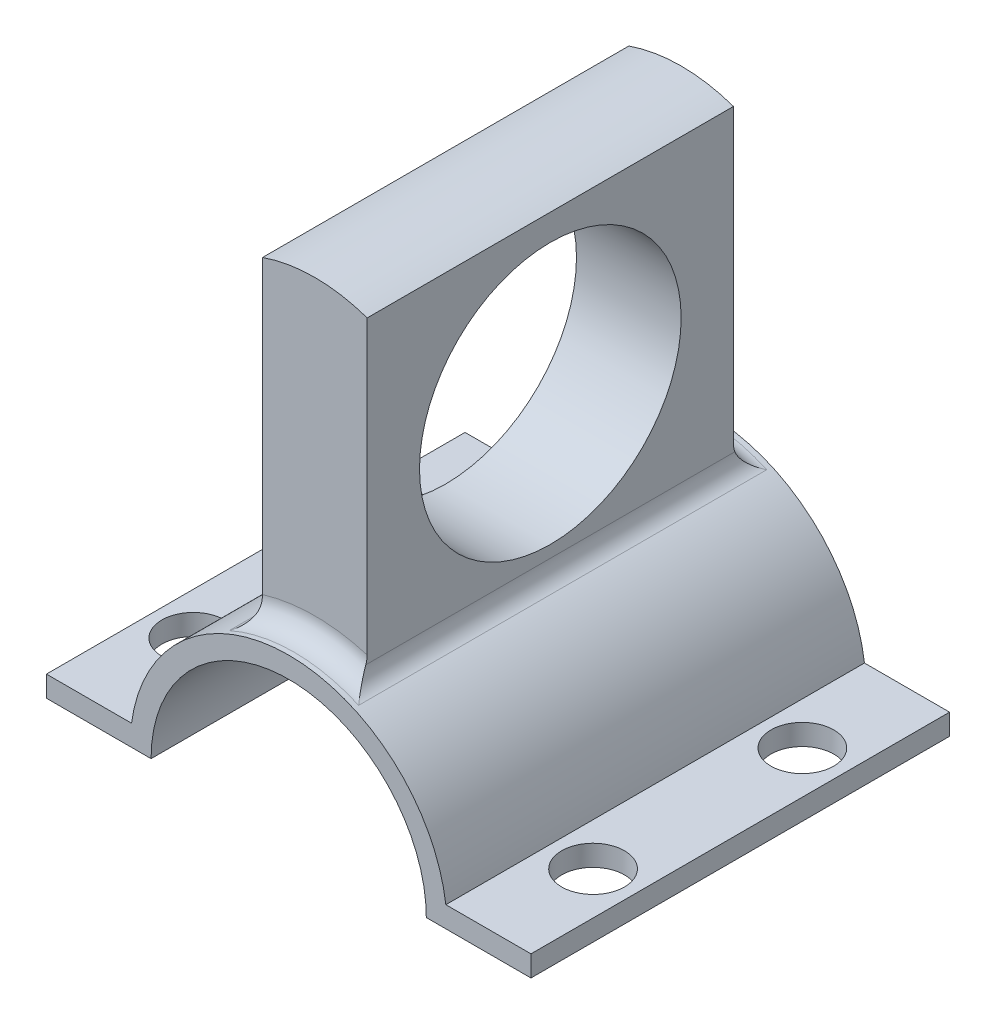
ISO-10303-21;
HEADER;
FILE_DESCRIPTION(('STEP AP214'),'2;1');
FILE_NAME('part.step','',(''),(''),'','','');
FILE_SCHEMA(('AUTOMOTIVE_DESIGN { 1 0 10303 214 1 1 1 1 }'));
ENDSEC;
DATA;
#1=APPLICATION_CONTEXT('core data for automotive mechanical design processes');
#2=APPLICATION_PROTOCOL_DEFINITION('international standard','automotive_design',2000,#1);
#3=PRODUCT_CONTEXT('',#1,'mechanical');
#4=PRODUCT('Part','Part','',(#3));
#5=PRODUCT_RELATED_PRODUCT_CATEGORY('part','',(#4));
#6=PRODUCT_DEFINITION_FORMATION('','',#4);
#7=PRODUCT_DEFINITION_CONTEXT('part definition',#1,'design');
#8=PRODUCT_DEFINITION('design','',#6,#7);
#9=PRODUCT_DEFINITION_SHAPE('','',#8);
#10=(LENGTH_UNIT() NAMED_UNIT(*) SI_UNIT(.MILLI.,.METRE.));
#11=(NAMED_UNIT(*) PLANE_ANGLE_UNIT() SI_UNIT($,.RADIAN.));
#12=(NAMED_UNIT(*) SI_UNIT($,.STERADIAN.) SOLID_ANGLE_UNIT());
#13=UNCERTAINTY_MEASURE_WITH_UNIT(LENGTH_MEASURE(1.E-05),#10,'distance_accuracy_value','');
#14=(GEOMETRIC_REPRESENTATION_CONTEXT(3) GLOBAL_UNCERTAINTY_ASSIGNED_CONTEXT((#13)) GLOBAL_UNIT_ASSIGNED_CONTEXT((#10,
#11,#12)) REPRESENTATION_CONTEXT('',''));
#15=CARTESIAN_POINT('',(0.,0.,0.));
#16=DIRECTION('',(0.,0.,1.));
#17=DIRECTION('',(1.,0.,0.));
#18=AXIS2_PLACEMENT_3D('',#15,#16,#17);
#19=CARTESIAN_POINT('',(16.7005,0.,25.4));
#20=DIRECTION('',(0.,1.,0.));
#21=DIRECTION('',(-1.,0.,0.));
#22=AXIS2_PLACEMENT_3D('',#19,#20,#21);
#23=PLANE('',#22);
#24=CARTESIAN_POINT('',(24.2363031700751,0.,-12.7));
#25=DIRECTION('',(0.,1.,0.));
#26=DIRECTION('',(-1.,0.,0.));
#27=AXIS2_PLACEMENT_3D('',#24,#25,#26);
#28=CIRCLE('',#27,3.81);
#29=CARTESIAN_POINT('',(20.4263031700751,0.,-12.7));
#30=VERTEX_POINT('',#29);
#31=EDGE_CURVE('E197',#30,#30,#28,.T.);
#32=ORIENTED_EDGE('',*,*,#31,.T.);
#33=EDGE_LOOP('',(#32));
#34=FACE_BOUND('',#33,.T.);
#35=CARTESIAN_POINT('',(24.2363031700751,0.,12.7));
#36=DIRECTION('',(0.,1.,0.));
#37=DIRECTION('',(-1.,0.,0.));
#38=AXIS2_PLACEMENT_3D('',#35,#36,#37);
#39=CIRCLE('',#38,3.81);
#40=CARTESIAN_POINT('',(20.4263031700751,0.,12.7));
#41=VERTEX_POINT('',#40);
#42=EDGE_CURVE('E204',#41,#41,#39,.T.);
#43=ORIENTED_EDGE('',*,*,#42,.T.);
#44=EDGE_LOOP('',(#43));
#45=FACE_BOUND('',#44,.T.);
#46=DIRECTION('',(1.,0.,0.));
#47=VECTOR('',#46,1.);
#48=CARTESIAN_POINT('',(16.7005,0.,-25.4));
#49=LINE('',#48,#47);
#50=CARTESIAN_POINT('',(16.7005,0.,-25.4));
#51=VERTEX_POINT('',#50);
#52=CARTESIAN_POINT('',(29.4005,0.,-25.4));
#53=VERTEX_POINT('',#52);
#54=EDGE_CURVE('E207',#51,#53,#49,.T.);
#55=ORIENTED_EDGE('',*,*,#54,.T.);
#56=DIRECTION('',(0.,0.,-1.));
#57=VECTOR('',#56,1.);
#58=CARTESIAN_POINT('',(29.4005,0.,25.4));
#59=LINE('',#58,#57);
#60=CARTESIAN_POINT('',(29.4005,0.,25.4));
#61=VERTEX_POINT('',#60);
#62=EDGE_CURVE('E266',#61,#53,#59,.T.);
#63=ORIENTED_EDGE('',*,*,#62,.F.);
#64=DIRECTION('',(1.,0.,0.));
#65=VECTOR('',#64,1.);
#66=CARTESIAN_POINT('',(16.7005,0.,25.4));
#67=LINE('',#66,#65);
#68=CARTESIAN_POINT('',(16.7005,0.,25.4));
#69=VERTEX_POINT('',#68);
#70=EDGE_CURVE('E208',#69,#61,#67,.T.);
#71=ORIENTED_EDGE('',*,*,#70,.F.);
#72=DIRECTION('',(0.,0.,-1.));
#73=VECTOR('',#72,1.);
#74=CARTESIAN_POINT('',(16.7005,0.,25.4));
#75=LINE('',#74,#73);
#76=EDGE_CURVE('E230',#69,#51,#75,.T.);
#77=ORIENTED_EDGE('',*,*,#76,.T.);
#78=EDGE_LOOP('',(#55,#63,#71,#77));
#79=FACE_BOUND('',#78,.T.);
#80=ADVANCED_FACE('F33',(#34,#45,#79),#23,.F.);
#81=CARTESIAN_POINT('',(29.4005,2.54,25.4));
#82=DIRECTION('',(1.,0.,0.));
#83=DIRECTION('',(0.,0.,-1.));
#84=AXIS2_PLACEMENT_3D('',#81,#82,#83);
#85=PLANE('',#84);
#86=DIRECTION('',(0.,-1.,0.));
#87=VECTOR('',#86,1.);
#88=CARTESIAN_POINT('',(29.4005,2.54,-25.4));
#89=LINE('',#88,#87);
#90=CARTESIAN_POINT('',(29.4005,2.54,-25.4));
#91=VERTEX_POINT('',#90);
#92=EDGE_CURVE('E233',#91,#53,#89,.T.);
#93=ORIENTED_EDGE('',*,*,#92,.F.);
#94=DIRECTION('',(0.,0.,-1.));
#95=VECTOR('',#94,1.);
#96=CARTESIAN_POINT('',(29.4005,2.54,25.4));
#97=LINE('',#96,#95);
#98=CARTESIAN_POINT('',(29.4005,2.54,25.4));
#99=VERTEX_POINT('',#98);
#100=EDGE_CURVE('E264',#99,#91,#97,.T.);
#101=ORIENTED_EDGE('',*,*,#100,.F.);
#102=DIRECTION('',(0.,-1.,0.));
#103=VECTOR('',#102,1.);
#104=CARTESIAN_POINT('',(29.4005,2.54,25.4));
#105=LINE('',#104,#103);
#106=EDGE_CURVE('E210',#99,#61,#105,.T.);
#107=ORIENTED_EDGE('',*,*,#106,.T.);
#108=ORIENTED_EDGE('',*,*,#62,.T.);
#109=EDGE_LOOP('',(#93,#101,#107,#108));
#110=FACE_BOUND('',#109,.T.);
#111=ADVANCED_FACE('F366',(#110),#85,.T.);
#112=CARTESIAN_POINT('',(16.7005,2.54,25.4));
#113=DIRECTION('',(0.,1.,0.));
#114=DIRECTION('',(-1.,0.,0.));
#115=AXIS2_PLACEMENT_3D('',#112,#113,#114);
#116=PLANE('',#115);
#117=CARTESIAN_POINT('',(24.2363031700751,2.54,-12.7));
#118=DIRECTION('',(0.,1.,0.));
#119=DIRECTION('',(0.,0.,1.));
#120=AXIS2_PLACEMENT_3D('',#117,#118,#119);
#121=CIRCLE('',#120,3.81);
#122=CARTESIAN_POINT('',(24.2363031700751,2.54,-8.89));
#123=VERTEX_POINT('',#122);
#124=EDGE_CURVE('E188',#123,#123,#121,.T.);
#125=ORIENTED_EDGE('',*,*,#124,.F.);
#126=EDGE_LOOP('',(#125));
#127=FACE_BOUND('',#126,.T.);
#128=CARTESIAN_POINT('',(24.2363031700751,2.54,12.7));
#129=DIRECTION('',(0.,1.,0.));
#130=DIRECTION('',(0.,0.,1.));
#131=AXIS2_PLACEMENT_3D('',#128,#129,#130);
#132=CIRCLE('',#131,3.81);
#133=CARTESIAN_POINT('',(24.2363031700751,2.54,16.51));
#134=VERTEX_POINT('',#133);
#135=EDGE_CURVE('E200',#134,#134,#132,.T.);
#136=ORIENTED_EDGE('',*,*,#135,.F.);
#137=EDGE_LOOP('',(#136));
#138=FACE_BOUND('',#137,.T.);
#139=DIRECTION('',(1.,0.,0.));
#140=VECTOR('',#139,1.);
#141=CARTESIAN_POINT('',(16.7005,2.54,-25.4));
#142=LINE('',#141,#140);
#143=CARTESIAN_POINT('',(19.0721063401503,2.54,-25.4));
#144=VERTEX_POINT('',#143);
#145=EDGE_CURVE('E236',#144,#91,#142,.T.);
#146=ORIENTED_EDGE('',*,*,#145,.F.);
#147=DIRECTION('',(0.,0.,-1.));
#148=VECTOR('',#147,1.);
#149=CARTESIAN_POINT('',(19.0721063401503,2.54,25.4));
#150=LINE('',#149,#148);
#151=CARTESIAN_POINT('',(19.0721063401503,2.54,25.4));
#152=VERTEX_POINT('',#151);
#153=EDGE_CURVE('E262',#152,#144,#150,.T.);
#154=ORIENTED_EDGE('',*,*,#153,.F.);
#155=DIRECTION('',(1.,0.,0.));
#156=VECTOR('',#155,1.);
#157=CARTESIAN_POINT('',(16.7005,2.54,25.4));
#158=LINE('',#157,#156);
#159=EDGE_CURVE('E214',#152,#99,#158,.T.);
#160=ORIENTED_EDGE('',*,*,#159,.T.);
#161=ORIENTED_EDGE('',*,*,#100,.T.);
#162=EDGE_LOOP('',(#146,#154,#160,#161));
#163=FACE_BOUND('',#162,.T.);
#164=ADVANCED_FACE('F371',(#127,#138,#163),#116,.T.);
#165=CARTESIAN_POINT('',(0.,0.,25.4));
#166=DIRECTION('',(0.,0.,-1.));
#167=DIRECTION('',(-1.,0.,0.));
#168=AXIS2_PLACEMENT_3D('',#165,#166,#167);
#169=CYLINDRICAL_SURFACE('',#168,19.2405);
#170=DIRECTION('',(0.,0.,-1.));
#171=VECTOR('',#170,1.);
#172=CARTESIAN_POINT('',(-7.85326530612244,17.5648246299715,25.4));
#173=LINE('',#172,#171);
#174=CARTESIAN_POINT('',(-7.85326530612245,17.5648246299715,24.765));
#175=VERTEX_POINT('',#174);
#176=CARTESIAN_POINT('',(-7.85326530612245,17.5648246299715,-24.765));
#177=VERTEX_POINT('',#176);
#178=EDGE_CURVE('E279',#175,#177,#173,.T.);
#179=ORIENTED_EDGE('',*,*,#178,.T.);
#180=CARTESIAN_POINT('',(0.,0.,-24.765));
#181=DIRECTION('',(0.,0.,-1.));
#182=DIRECTION('',(-1.,0.,0.));
#183=AXIS2_PLACEMENT_3D('',#180,#181,#182);
#184=CIRCLE('',#183,19.2405);
#185=CARTESIAN_POINT('',(7.85326530612245,17.5648246299715,-24.765));
#186=VERTEX_POINT('',#185);
#187=EDGE_CURVE('E281',#177,#186,#184,.T.);
#188=ORIENTED_EDGE('',*,*,#187,.T.);
#189=DIRECTION('',(0.,0.,-1.));
#190=VECTOR('',#189,1.);
#191=CARTESIAN_POINT('',(7.85326530612245,17.5648246299715,25.4));
#192=LINE('',#191,#190);
#193=CARTESIAN_POINT('',(7.85326530612245,17.5648246299715,24.765));
#194=VERTEX_POINT('',#193);
#195=EDGE_CURVE('E275',#186,#194,#192,.F.);
#196=ORIENTED_EDGE('',*,*,#195,.T.);
#197=CARTESIAN_POINT('',(0.,0.,24.765));
#198=DIRECTION('',(0.,0.,1.));
#199=DIRECTION('',(1.,0.,0.));
#200=AXIS2_PLACEMENT_3D('',#197,#198,#199);
#201=CIRCLE('',#200,19.2405);
#202=EDGE_CURVE('E277',#194,#175,#201,.T.);
#203=ORIENTED_EDGE('',*,*,#202,.T.);
#204=EDGE_LOOP('',(#179,#188,#196,#203));
#205=FACE_BOUND('',#204,.T.);
#206=CARTESIAN_POINT('',(0.,0.,-25.4));
#207=DIRECTION('',(0.,0.,1.));
#208=DIRECTION('',(1.,0.,0.));
#209=AXIS2_PLACEMENT_3D('',#206,#207,#208);
#210=CIRCLE('',#209,19.2405);
#211=CARTESIAN_POINT('',(-19.0721063401503,2.54,-25.4));
#212=VERTEX_POINT('',#211);
#213=EDGE_CURVE('E239',#212,#144,#210,.F.);
#214=ORIENTED_EDGE('',*,*,#213,.F.);
#215=DIRECTION('',(0.,0.,-1.));
#216=VECTOR('',#215,1.);
#217=CARTESIAN_POINT('',(-19.0721063401503,2.54,25.4));
#218=LINE('',#217,#216);
#219=CARTESIAN_POINT('',(-19.0721063401503,2.54,25.4));
#220=VERTEX_POINT('',#219);
#221=EDGE_CURVE('E260',#220,#212,#218,.T.);
#222=ORIENTED_EDGE('',*,*,#221,.F.);
#223=CARTESIAN_POINT('',(0.,0.,25.4));
#224=DIRECTION('',(0.,0.,1.));
#225=DIRECTION('',(1.,0.,0.));
#226=AXIS2_PLACEMENT_3D('',#223,#224,#225);
#227=CIRCLE('',#226,19.2405);
#228=EDGE_CURVE('E217',#220,#152,#227,.F.);
#229=ORIENTED_EDGE('',*,*,#228,.T.);
#230=ORIENTED_EDGE('',*,*,#153,.T.);
#231=EDGE_LOOP('',(#214,#222,#229,#230));
#232=FACE_BOUND('',#231,.T.);
#233=ADVANCED_FACE('F352',(#205,#232),#169,.T.);
#234=CARTESIAN_POINT('',(-16.7005,2.54,25.4));
#235=DIRECTION('',(0.,1.,0.));
#236=DIRECTION('',(-1.,0.,0.));
#237=AXIS2_PLACEMENT_3D('',#234,#235,#236);
#238=PLANE('',#237);
#239=CARTESIAN_POINT('',(-24.2776968299249,2.54,12.7000000000003));
#240=DIRECTION('',(0.,1.,0.));
#241=DIRECTION('',(0.,0.,1.));
#242=AXIS2_PLACEMENT_3D('',#239,#240,#241);
#243=CIRCLE('',#242,3.81);
#244=CARTESIAN_POINT('',(-24.2776968299249,2.54,16.5100000000003));
#245=VERTEX_POINT('',#244);
#246=EDGE_CURVE('E192',#245,#245,#243,.T.);
#247=ORIENTED_EDGE('',*,*,#246,.F.);
#248=EDGE_LOOP('',(#247));
#249=FACE_BOUND('',#248,.T.);
#250=CARTESIAN_POINT('',(-24.2776968299249,2.54,-12.6999999999997));
#251=DIRECTION('',(0.,1.,0.));
#252=DIRECTION('',(0.,0.,1.));
#253=AXIS2_PLACEMENT_3D('',#250,#251,#252);
#254=CIRCLE('',#253,3.81);
#255=CARTESIAN_POINT('',(-24.2776968299249,2.54,-8.88999999999966));
#256=VERTEX_POINT('',#255);
#257=EDGE_CURVE('E170',#256,#256,#254,.T.);
#258=ORIENTED_EDGE('',*,*,#257,.F.);
#259=EDGE_LOOP('',(#258));
#260=FACE_BOUND('',#259,.T.);
#261=DIRECTION('',(1.,0.,0.));
#262=VECTOR('',#261,1.);
#263=CARTESIAN_POINT('',(-16.7005,2.54,-25.4));
#264=LINE('',#263,#262);
#265=CARTESIAN_POINT('',(-29.4005,2.54,-25.4));
#266=VERTEX_POINT('',#265);
#267=EDGE_CURVE('E242',#266,#212,#264,.T.);
#268=ORIENTED_EDGE('',*,*,#267,.F.);
#269=DIRECTION('',(0.,0.,-1.));
#270=VECTOR('',#269,1.);
#271=CARTESIAN_POINT('',(-29.4005,2.54,25.4));
#272=LINE('',#271,#270);
#273=CARTESIAN_POINT('',(-29.4005,2.54,25.4));
#274=VERTEX_POINT('',#273);
#275=EDGE_CURVE('E258',#274,#266,#272,.T.);
#276=ORIENTED_EDGE('',*,*,#275,.F.);
#277=DIRECTION('',(1.,0.,0.));
#278=VECTOR('',#277,1.);
#279=CARTESIAN_POINT('',(-16.7005,2.54,25.4));
#280=LINE('',#279,#278);
#281=EDGE_CURVE('E220',#274,#220,#280,.T.);
#282=ORIENTED_EDGE('',*,*,#281,.T.);
#283=ORIENTED_EDGE('',*,*,#221,.T.);
#284=EDGE_LOOP('',(#268,#276,#282,#283));
#285=FACE_BOUND('',#284,.T.);
#286=ADVANCED_FACE('F381',(#249,#260,#285),#238,.T.);
#287=CARTESIAN_POINT('',(-29.4005,0.,25.4));
#288=DIRECTION('',(-1.,0.,0.));
#289=DIRECTION('',(0.,0.,1.));
#290=AXIS2_PLACEMENT_3D('',#287,#288,#289);
#291=PLANE('',#290);
#292=DIRECTION('',(0.,1.,0.));
#293=VECTOR('',#292,1.);
#294=CARTESIAN_POINT('',(-29.4005,0.,-25.4));
#295=LINE('',#294,#293);
#296=CARTESIAN_POINT('',(-29.4005,0.,-25.4));
#297=VERTEX_POINT('',#296);
#298=EDGE_CURVE('E245',#297,#266,#295,.T.);
#299=ORIENTED_EDGE('',*,*,#298,.F.);
#300=DIRECTION('',(0.,0.,-1.));
#301=VECTOR('',#300,1.);
#302=CARTESIAN_POINT('',(-29.4005,0.,25.4));
#303=LINE('',#302,#301);
#304=CARTESIAN_POINT('',(-29.4005,0.,25.4));
#305=VERTEX_POINT('',#304);
#306=EDGE_CURVE('E256',#305,#297,#303,.T.);
#307=ORIENTED_EDGE('',*,*,#306,.F.);
#308=DIRECTION('',(0.,1.,0.));
#309=VECTOR('',#308,1.);
#310=CARTESIAN_POINT('',(-29.4005,0.,25.4));
#311=LINE('',#310,#309);
#312=EDGE_CURVE('E223',#305,#274,#311,.T.);
#313=ORIENTED_EDGE('',*,*,#312,.T.);
#314=ORIENTED_EDGE('',*,*,#275,.T.);
#315=EDGE_LOOP('',(#299,#307,#313,#314));
#316=FACE_BOUND('',#315,.T.);
#317=ADVANCED_FACE('F384',(#316),#291,.T.);
#318=CARTESIAN_POINT('',(-16.7005,0.,25.4));
#319=DIRECTION('',(0.,1.,0.));
#320=DIRECTION('',(-1.,0.,0.));
#321=AXIS2_PLACEMENT_3D('',#318,#319,#320);
#322=PLANE('',#321);
#323=CARTESIAN_POINT('',(-24.2776968299249,0.,12.7000000000003));
#324=DIRECTION('',(0.,1.,0.));
#325=DIRECTION('',(-1.,0.,0.));
#326=AXIS2_PLACEMENT_3D('',#323,#324,#325);
#327=CIRCLE('',#326,3.81);
#328=CARTESIAN_POINT('',(-28.0876968299249,0.,12.7000000000003));
#329=VERTEX_POINT('',#328);
#330=EDGE_CURVE('E201',#329,#329,#327,.T.);
#331=ORIENTED_EDGE('',*,*,#330,.T.);
#332=EDGE_LOOP('',(#331));
#333=FACE_BOUND('',#332,.T.);
#334=CARTESIAN_POINT('',(-24.2776968299249,0.,-12.6999999999997));
#335=DIRECTION('',(0.,1.,0.));
#336=DIRECTION('',(-1.,0.,0.));
#337=AXIS2_PLACEMENT_3D('',#334,#335,#336);
#338=CIRCLE('',#337,3.81);
#339=CARTESIAN_POINT('',(-28.0876968299249,0.,-12.6999999999997));
#340=VERTEX_POINT('',#339);
#341=EDGE_CURVE('E191',#340,#340,#338,.T.);
#342=ORIENTED_EDGE('',*,*,#341,.T.);
#343=EDGE_LOOP('',(#342));
#344=FACE_BOUND('',#343,.T.);
#345=DIRECTION('',(1.,0.,0.));
#346=VECTOR('',#345,1.);
#347=CARTESIAN_POINT('',(-16.7005,0.,-25.4));
#348=LINE('',#347,#346);
#349=CARTESIAN_POINT('',(-16.7005,0.,-25.4));
#350=VERTEX_POINT('',#349);
#351=EDGE_CURVE('E248',#297,#350,#348,.T.);
#352=ORIENTED_EDGE('',*,*,#351,.T.);
#353=DIRECTION('',(0.,0.,-1.));
#354=VECTOR('',#353,1.);
#355=CARTESIAN_POINT('',(-16.7005,0.,25.4));
#356=LINE('',#355,#354);
#357=CARTESIAN_POINT('',(-16.7005,0.,25.4));
#358=VERTEX_POINT('',#357);
#359=EDGE_CURVE('E253',#358,#350,#356,.T.);
#360=ORIENTED_EDGE('',*,*,#359,.F.);
#361=DIRECTION('',(1.,0.,0.));
#362=VECTOR('',#361,1.);
#363=CARTESIAN_POINT('',(-16.7005,0.,25.4));
#364=LINE('',#363,#362);
#365=EDGE_CURVE('E226',#305,#358,#364,.T.);
#366=ORIENTED_EDGE('',*,*,#365,.F.);
#367=ORIENTED_EDGE('',*,*,#306,.T.);
#368=EDGE_LOOP('',(#352,#360,#366,#367));
#369=FACE_BOUND('',#368,.T.);
#370=ADVANCED_FACE('F388',(#333,#344,#369),#322,.F.);
#371=CARTESIAN_POINT('',(0.,0.,25.4));
#372=DIRECTION('',(0.,0.,-1.));
#373=DIRECTION('',(-1.,0.,0.));
#374=AXIS2_PLACEMENT_3D('',#371,#372,#373);
#375=CYLINDRICAL_SURFACE('',#374,16.7005);
#376=CARTESIAN_POINT('',(0.,0.,-25.4));
#377=DIRECTION('',(0.,0.,-1.));
#378=DIRECTION('',(-1.,0.,0.));
#379=AXIS2_PLACEMENT_3D('',#376,#377,#378);
#380=CIRCLE('',#379,16.7005);
#381=EDGE_CURVE('E211',#350,#51,#380,.T.);
#382=ORIENTED_EDGE('',*,*,#381,.T.);
#383=ORIENTED_EDGE('',*,*,#76,.F.);
#384=CARTESIAN_POINT('',(0.,0.,25.4));
#385=DIRECTION('',(0.,0.,-1.));
#386=DIRECTION('',(-1.,0.,0.));
#387=AXIS2_PLACEMENT_3D('',#384,#385,#386);
#388=CIRCLE('',#387,16.7005);
#389=EDGE_CURVE('E228',#358,#69,#388,.T.);
#390=ORIENTED_EDGE('',*,*,#389,.F.);
#391=ORIENTED_EDGE('',*,*,#359,.T.);
#392=EDGE_LOOP('',(#382,#383,#390,#391));
#393=FACE_BOUND('',#392,.T.);
#394=ADVANCED_FACE('F392',(#393),#375,.F.);
#395=CARTESIAN_POINT('',(0.,0.,25.4));
#396=DIRECTION('',(0.,0.,1.));
#397=DIRECTION('',(1.,0.,0.));
#398=AXIS2_PLACEMENT_3D('',#395,#396,#397);
#399=PLANE('',#398);
#400=ORIENTED_EDGE('',*,*,#70,.T.);
#401=ORIENTED_EDGE('',*,*,#106,.F.);
#402=ORIENTED_EDGE('',*,*,#159,.F.);
#403=ORIENTED_EDGE('',*,*,#228,.F.);
#404=ORIENTED_EDGE('',*,*,#281,.F.);
#405=ORIENTED_EDGE('',*,*,#312,.F.);
#406=ORIENTED_EDGE('',*,*,#365,.T.);
#407=ORIENTED_EDGE('',*,*,#389,.T.);
#408=EDGE_LOOP('',(#400,#401,#402,#403,#404,#405,#406,#407));
#409=FACE_BOUND('',#408,.T.);
#410=ADVANCED_FACE('F396',(#409),#399,.T.);
#411=CARTESIAN_POINT('',(0.,0.,-25.4));
#412=DIRECTION('',(0.,0.,1.));
#413=DIRECTION('',(1.,0.,0.));
#414=AXIS2_PLACEMENT_3D('',#411,#412,#413);
#415=PLANE('',#414);
#416=ORIENTED_EDGE('',*,*,#54,.F.);
#417=ORIENTED_EDGE('',*,*,#381,.F.);
#418=ORIENTED_EDGE('',*,*,#351,.F.);
#419=ORIENTED_EDGE('',*,*,#298,.T.);
#420=ORIENTED_EDGE('',*,*,#267,.T.);
#421=ORIENTED_EDGE('',*,*,#213,.T.);
#422=ORIENTED_EDGE('',*,*,#145,.T.);
#423=ORIENTED_EDGE('',*,*,#92,.T.);
#424=EDGE_LOOP('',(#416,#417,#418,#419,#420,#421,#422,#423));
#425=FACE_BOUND('',#424,.T.);
#426=ADVANCED_FACE('F398',(#425),#415,.F.);
#427=CARTESIAN_POINT('',(24.2363031700751,-8.382,12.7));
#428=DIRECTION('',(0.,1.,0.));
#429=DIRECTION('',(0.,0.,1.));
#430=AXIS2_PLACEMENT_3D('',#427,#428,#429);
#431=CYLINDRICAL_SURFACE('',#430,3.81);
#432=ORIENTED_EDGE('',*,*,#135,.T.);
#433=EDGE_LOOP('',(#432));
#434=FACE_BOUND('',#433,.T.);
#435=ORIENTED_EDGE('',*,*,#42,.F.);
#436=EDGE_LOOP('',(#435));
#437=FACE_BOUND('',#436,.T.);
#438=ADVANCED_FACE('F401',(#434,#437),#431,.F.);
#439=CARTESIAN_POINT('',(-24.2776968299249,-8.382,-12.6999999999997));
#440=DIRECTION('',(0.,1.,0.));
#441=DIRECTION('',(0.,0.,1.));
#442=AXIS2_PLACEMENT_3D('',#439,#440,#441);
#443=CYLINDRICAL_SURFACE('',#442,3.81);
#444=ORIENTED_EDGE('',*,*,#257,.T.);
#445=EDGE_LOOP('',(#444));
#446=FACE_BOUND('',#445,.T.);
#447=ORIENTED_EDGE('',*,*,#341,.F.);
#448=EDGE_LOOP('',(#447));
#449=FACE_BOUND('',#448,.T.);
#450=ADVANCED_FACE('F408',(#446,#449),#443,.F.);
#451=CARTESIAN_POINT('',(-24.2776968299249,-8.382,12.7000000000003));
#452=DIRECTION('',(0.,1.,0.));
#453=DIRECTION('',(0.,0.,1.));
#454=AXIS2_PLACEMENT_3D('',#451,#452,#453);
#455=CYLINDRICAL_SURFACE('',#454,3.81);
#456=ORIENTED_EDGE('',*,*,#246,.T.);
#457=EDGE_LOOP('',(#456));
#458=FACE_BOUND('',#457,.T.);
#459=ORIENTED_EDGE('',*,*,#330,.F.);
#460=EDGE_LOOP('',(#459));
#461=FACE_BOUND('',#460,.T.);
#462=ADVANCED_FACE('F412',(#458,#461),#455,.F.);
#463=CARTESIAN_POINT('',(24.2363031700751,-8.382,-12.7));
#464=DIRECTION('',(0.,1.,0.));
#465=DIRECTION('',(0.,0.,1.));
#466=AXIS2_PLACEMENT_3D('',#463,#464,#465);
#467=CYLINDRICAL_SURFACE('',#466,3.81);
#468=ORIENTED_EDGE('',*,*,#124,.T.);
#469=EDGE_LOOP('',(#468));
#470=FACE_BOUND('',#469,.T.);
#471=ORIENTED_EDGE('',*,*,#31,.F.);
#472=EDGE_LOOP('',(#471));
#473=FACE_BOUND('',#472,.T.);
#474=ADVANCED_FACE('F416',(#470,#473),#467,.F.);
#475=CARTESIAN_POINT('',(0.,38.1,25.4));
#476=DIRECTION('',(0.,0.,-1.));
#477=DIRECTION('',(-1.,0.,0.));
#478=AXIS2_PLACEMENT_3D('',#475,#476,#477);
#479=CYLINDRICAL_SURFACE('',#478,19.2405);
#480=DIRECTION('',(0.,0.,-1.));
#481=VECTOR('',#480,1.);
#482=CARTESIAN_POINT('',(-6.35,56.2624431244808,25.4));
#483=LINE('',#482,#481);
#484=CARTESIAN_POINT('',(-6.35,56.2624431244808,22.225));
#485=VERTEX_POINT('',#484);
#486=CARTESIAN_POINT('',(-6.35,56.2624431244808,-22.225));
#487=VERTEX_POINT('',#486);
#488=EDGE_CURVE('E155',#485,#487,#483,.T.);
#489=ORIENTED_EDGE('',*,*,#488,.F.);
#490=CARTESIAN_POINT('',(0.,38.1,22.225));
#491=DIRECTION('',(0.,0.,-1.));
#492=DIRECTION('',(-1.,0.,0.));
#493=AXIS2_PLACEMENT_3D('',#490,#491,#492);
#494=CIRCLE('',#493,19.2405);
#495=CARTESIAN_POINT('',(6.35,56.2624431244808,22.225));
#496=VERTEX_POINT('',#495);
#497=EDGE_CURVE('E160',#485,#496,#494,.T.);
#498=ORIENTED_EDGE('',*,*,#497,.T.);
#499=DIRECTION('',(0.,0.,-1.));
#500=VECTOR('',#499,1.);
#501=CARTESIAN_POINT('',(6.35,56.2624431244808,25.4));
#502=LINE('',#501,#500);
#503=CARTESIAN_POINT('',(6.35,56.2624431244808,-22.225));
#504=VERTEX_POINT('',#503);
#505=EDGE_CURVE('E182',#496,#504,#502,.T.);
#506=ORIENTED_EDGE('',*,*,#505,.T.);
#507=CARTESIAN_POINT('',(0.,38.1,-22.225));
#508=DIRECTION('',(0.,0.,1.));
#509=DIRECTION('',(1.,0.,0.));
#510=AXIS2_PLACEMENT_3D('',#507,#508,#509);
#511=CIRCLE('',#510,19.2405);
#512=EDGE_CURVE('E169',#504,#487,#511,.T.);
#513=ORIENTED_EDGE('',*,*,#512,.T.);
#514=EDGE_LOOP('',(#489,#498,#506,#513));
#515=FACE_BOUND('',#514,.T.);
#516=ADVANCED_FACE('F165',(#515),#479,.T.);
#517=CARTESIAN_POINT('',(6.35,18.1624431244808,22.225));
#518=DIRECTION('',(0.,0.,1.));
#519=DIRECTION('',(1.,0.,0.));
#520=AXIS2_PLACEMENT_3D('',#517,#518,#519);
#521=PLANE('',#520);
#522=DIRECTION('',(0.,1.,0.));
#523=VECTOR('',#522,1.);
#524=CARTESIAN_POINT('',(-6.35,18.1624431244808,22.225));
#525=LINE('',#524,#523);
#526=CARTESIAN_POINT('',(-6.35,20.834290970657,22.225));
#527=VERTEX_POINT('',#526);
#528=EDGE_CURVE('E151',#527,#485,#525,.T.);
#529=ORIENTED_EDGE('',*,*,#528,.F.);
#530=CARTESIAN_POINT('',(0.,0.,22.225));
#531=DIRECTION('',(0.,0.,1.));
#532=DIRECTION('',(1.,0.,0.));
#533=AXIS2_PLACEMENT_3D('',#530,#531,#532);
#534=CIRCLE('',#533,21.7805);
#535=CARTESIAN_POINT('',(6.35,20.834290970657,22.225));
#536=VERTEX_POINT('',#535);
#537=EDGE_CURVE('E285',#527,#536,#534,.F.);
#538=ORIENTED_EDGE('',*,*,#537,.T.);
#539=DIRECTION('',(0.,1.,0.));
#540=VECTOR('',#539,1.);
#541=CARTESIAN_POINT('',(6.35,18.1624431244808,22.225));
#542=LINE('',#541,#540);
#543=EDGE_CURVE('E159',#536,#496,#542,.T.);
#544=ORIENTED_EDGE('',*,*,#543,.T.);
#545=ORIENTED_EDGE('',*,*,#497,.F.);
#546=EDGE_LOOP('',(#529,#538,#544,#545));
#547=FACE_BOUND('',#546,.T.);
#548=ADVANCED_FACE('F173',(#547),#521,.T.);
#549=CARTESIAN_POINT('',(6.35,18.1624431244808,25.4));
#550=DIRECTION('',(1.,0.,0.));
#551=DIRECTION('',(0.,0.,-1.));
#552=AXIS2_PLACEMENT_3D('',#549,#550,#551);
#553=PLANE('',#552);
#554=CARTESIAN_POINT('',(6.35,37.2124431244808,0.));
#555=DIRECTION('',(1.,0.,0.));
#556=DIRECTION('',(0.,0.,-1.));
#557=AXIS2_PLACEMENT_3D('',#554,#555,#556);
#558=CIRCLE('',#557,15.875);
#559=CARTESIAN_POINT('',(6.35,37.2124431244808,-15.875));
#560=VERTEX_POINT('',#559);
#561=EDGE_CURVE('E178',#560,#560,#558,.T.);
#562=ORIENTED_EDGE('',*,*,#561,.F.);
#563=EDGE_LOOP('',(#562));
#564=FACE_BOUND('',#563,.T.);
#565=CARTESIAN_POINT('',(6.35,20.834290970657,22.225));
#566=CARTESIAN_POINT('',(6.35,20.7531256802374,22.2249936243517));
#567=CARTESIAN_POINT('',(6.35,20.6719625991684,22.2285597478441));
#568=CARTESIAN_POINT('',(6.35,20.5108693430892,22.2427132126116));
#569=CARTESIAN_POINT('',(6.35,20.4309344860778,22.2532472776291));
#570=CARTESIAN_POINT('',(6.35,20.2722826759091,22.2812148947586));
#571=CARTESIAN_POINT('',(6.35,20.1935656910065,22.2986482667162));
#572=CARTESIAN_POINT('',(6.35,20.0373523226176,22.3404492472324));
#573=CARTESIAN_POINT('',(6.35,19.9598698016626,22.3648686573226));
#574=CARTESIAN_POINT('',(6.35,19.8836133600007,22.3926643548561));
#575=B_SPLINE_CURVE_WITH_KNOTS('',3,(#565,#566,#567,#568,#569,#570,#571,#572,#573,#574),
.UNSPECIFIED.,.F.,.F.,(4,2,2,2,4),(0.,0.243414253452601,0.484988569199596,0.726556577386167,
0.969964424813625),.UNSPECIFIED.);
#576=CARTESIAN_POINT('',(6.35,19.8836133600007,22.3926643548561));
#577=VERTEX_POINT('',#576);
#578=EDGE_CURVE('E46',#536,#577,#575,.T.);
#579=ORIENTED_EDGE('',*,*,#578,.T.);
#580=DIRECTION('',(0.,0.,1.));
#581=VECTOR('',#580,1.);
#582=CARTESIAN_POINT('',(6.35,19.8836133600007,-22.225));
#583=LINE('',#582,#581);
#584=CARTESIAN_POINT('',(6.35,19.8836133600007,-22.3926643548561));
#585=VERTEX_POINT('',#584);
#586=EDGE_CURVE('E54',#577,#585,#583,.F.);
#587=ORIENTED_EDGE('',*,*,#586,.T.);
#588=CARTESIAN_POINT('',(6.35,19.8836133600007,-22.3926643548561));
#589=CARTESIAN_POINT('',(6.35,19.9598698016626,-22.3648686573226));
#590=CARTESIAN_POINT('',(6.35,20.0373523226176,-22.3404492472324));
#591=CARTESIAN_POINT('',(6.35,20.1935656910065,-22.2986482667162));
#592=CARTESIAN_POINT('',(6.35,20.2722826759091,-22.2812148947586));
#593=CARTESIAN_POINT('',(6.35,20.4309344860778,-22.2532472776291));
#594=CARTESIAN_POINT('',(6.35,20.5108693430892,-22.2427132126116));
#595=CARTESIAN_POINT('',(6.35,20.6719625991684,-22.2285597478441));
#596=CARTESIAN_POINT('',(6.35,20.7531256802373,-22.2249936243517));
#597=CARTESIAN_POINT('',(6.35,20.834290970657,-22.225));
#598=B_SPLINE_CURVE_WITH_KNOTS('',3,(#588,#589,#590,#591,#592,#593,#594,#595,#596,#597),
.UNSPECIFIED.,.F.,.F.,(4,2,2,2,4),(0.,0.243407847427458,0.484975855614025,0.726550171361021,
0.969964424813618),.UNSPECIFIED.);
#599=CARTESIAN_POINT('',(6.35,20.834290970657,-22.225));
#600=VERTEX_POINT('',#599);
#601=EDGE_CURVE('E295',#585,#600,#598,.T.);
#602=ORIENTED_EDGE('',*,*,#601,.T.);
#603=DIRECTION('',(0.,1.,0.));
#604=VECTOR('',#603,1.);
#605=CARTESIAN_POINT('',(6.35,18.1624431244808,-22.225));
#606=LINE('',#605,#604);
#607=EDGE_CURVE('E185',#600,#504,#606,.T.);
#608=ORIENTED_EDGE('',*,*,#607,.T.);
#609=ORIENTED_EDGE('',*,*,#505,.F.);
#610=ORIENTED_EDGE('',*,*,#543,.F.);
#611=EDGE_LOOP('',(#579,#587,#602,#608,#609,#610));
#612=FACE_BOUND('',#611,.T.);
#613=ADVANCED_FACE('F344',(#564,#612),#553,.T.);
#614=CARTESIAN_POINT('',(-6.35,18.1624431244808,-22.225));
#615=DIRECTION('',(0.,0.,-1.));
#616=DIRECTION('',(-1.,0.,0.));
#617=AXIS2_PLACEMENT_3D('',#614,#615,#616);
#618=PLANE('',#617);
#619=ORIENTED_EDGE('',*,*,#607,.F.);
#620=CARTESIAN_POINT('',(0.,0.,-22.225));
#621=DIRECTION('',(0.,0.,-1.));
#622=DIRECTION('',(-1.,0.,0.));
#623=AXIS2_PLACEMENT_3D('',#620,#621,#622);
#624=CIRCLE('',#623,21.7805);
#625=CARTESIAN_POINT('',(-6.35,20.834290970657,-22.225));
#626=VERTEX_POINT('',#625);
#627=EDGE_CURVE('E268',#600,#626,#624,.F.);
#628=ORIENTED_EDGE('',*,*,#627,.T.);
#629=DIRECTION('',(0.,1.,0.));
#630=VECTOR('',#629,1.);
#631=CARTESIAN_POINT('',(-6.35,18.1624431244808,-22.225));
#632=LINE('',#631,#630);
#633=EDGE_CURVE('E171',#626,#487,#632,.T.);
#634=ORIENTED_EDGE('',*,*,#633,.T.);
#635=ORIENTED_EDGE('',*,*,#512,.F.);
#636=EDGE_LOOP('',(#619,#628,#634,#635));
#637=FACE_BOUND('',#636,.T.);
#638=ADVANCED_FACE('F347',(#637),#618,.T.);
#639=CARTESIAN_POINT('',(-6.35,18.1624431244808,25.4));
#640=DIRECTION('',(1.,0.,0.));
#641=DIRECTION('',(0.,0.,-1.));
#642=AXIS2_PLACEMENT_3D('',#639,#640,#641);
#643=PLANE('',#642);
#644=CARTESIAN_POINT('',(-6.35,37.2124431244808,0.));
#645=DIRECTION('',(1.,0.,0.));
#646=DIRECTION('',(0.,0.,-1.));
#647=AXIS2_PLACEMENT_3D('',#644,#645,#646);
#648=CIRCLE('',#647,15.875);
#649=CARTESIAN_POINT('',(-6.35,37.2124431244808,-15.875));
#650=VERTEX_POINT('',#649);
#651=EDGE_CURVE('E175',#650,#650,#648,.T.);
#652=ORIENTED_EDGE('',*,*,#651,.T.);
#653=EDGE_LOOP('',(#652));
#654=FACE_BOUND('',#653,.T.);
#655=CARTESIAN_POINT('',(-6.35,20.834290970657,-22.225));
#656=CARTESIAN_POINT('',(-6.35,20.7531256802374,-22.2249936243517));
#657=CARTESIAN_POINT('',(-6.35,20.6719625991684,-22.2285597478441));
#658=CARTESIAN_POINT('',(-6.35,20.5108693430892,-22.2427132126116));
#659=CARTESIAN_POINT('',(-6.35,20.4309344860778,-22.2532472776291));
#660=CARTESIAN_POINT('',(-6.35,20.2722826759091,-22.2812148947586));
#661=CARTESIAN_POINT('',(-6.35,20.1935656910065,-22.2986482667162));
#662=CARTESIAN_POINT('',(-6.35,20.0373523226176,-22.3404492472324));
#663=CARTESIAN_POINT('',(-6.35,19.9598698016626,-22.3648686573226));
#664=CARTESIAN_POINT('',(-6.35,19.8836133600007,-22.3926643548561));
#665=B_SPLINE_CURVE_WITH_KNOTS('',3,(#655,#656,#657,#658,#659,#660,#661,#662,#663,#664),
.UNSPECIFIED.,.F.,.F.,(4,2,2,2,4),(0.,0.243414253452601,0.484988569199596,0.726556577386167,
0.969964424813625),.UNSPECIFIED.);
#666=CARTESIAN_POINT('',(-6.35,19.8836133600007,-22.3926643548561));
#667=VERTEX_POINT('',#666);
#668=EDGE_CURVE('E288',#626,#667,#665,.T.);
#669=ORIENTED_EDGE('',*,*,#668,.T.);
#670=DIRECTION('',(0.,0.,-1.));
#671=VECTOR('',#670,1.);
#672=CARTESIAN_POINT('',(-6.35,19.8836133600007,25.4));
#673=LINE('',#672,#671);
#674=CARTESIAN_POINT('',(-6.35,19.8836133600007,22.3926643548561));
#675=VERTEX_POINT('',#674);
#676=EDGE_CURVE('E61',#667,#675,#673,.F.);
#677=ORIENTED_EDGE('',*,*,#676,.T.);
#678=CARTESIAN_POINT('',(-6.35,19.8836133600007,22.3926643548561));
#679=CARTESIAN_POINT('',(-6.35,19.9598698016626,22.3648686573226));
#680=CARTESIAN_POINT('',(-6.35,20.0373523226176,22.3404492472324));
#681=CARTESIAN_POINT('',(-6.35,20.1935656910065,22.2986482667162));
#682=CARTESIAN_POINT('',(-6.35,20.2722826759091,22.2812148947586));
#683=CARTESIAN_POINT('',(-6.35,20.4309344860778,22.2532472776291));
#684=CARTESIAN_POINT('',(-6.35,20.5108693430892,22.2427132126116));
#685=CARTESIAN_POINT('',(-6.35,20.6719625991684,22.2285597478441));
#686=CARTESIAN_POINT('',(-6.35,20.7531256802374,22.2249936243517));
#687=CARTESIAN_POINT('',(-6.35,20.834290970657,22.225));
#688=B_SPLINE_CURVE_WITH_KNOTS('',3,(#678,#679,#680,#681,#682,#683,#684,#685,#686,#687),
.UNSPECIFIED.,.F.,.F.,(4,2,2,2,4),(0.,0.243407847427458,0.484975855614029,0.726550171361017,
0.969964424813625),.UNSPECIFIED.);
#689=EDGE_CURVE('E11',#675,#527,#688,.T.);
#690=ORIENTED_EDGE('',*,*,#689,.T.);
#691=ORIENTED_EDGE('',*,*,#528,.T.);
#692=ORIENTED_EDGE('',*,*,#488,.T.);
#693=ORIENTED_EDGE('',*,*,#633,.F.);
#694=EDGE_LOOP('',(#669,#677,#690,#691,#692,#693));
#695=FACE_BOUND('',#694,.T.);
#696=ADVANCED_FACE('F153',(#654,#695),#643,.F.);
#697=CARTESIAN_POINT('',(-31.75,37.2124431244808,0.));
#698=DIRECTION('',(1.,0.,0.));
#699=DIRECTION('',(0.,0.,-1.));
#700=AXIS2_PLACEMENT_3D('',#697,#698,#699);
#701=CYLINDRICAL_SURFACE('',#700,15.875);
#702=CARTESIAN_POINT('',(6.35,37.2124431244808,-15.875));
#703=CARTESIAN_POINT('',(6.21770833333334,37.2124431244808,-15.875));
#704=CARTESIAN_POINT('',(6.08541666666667,37.2124431244808,-15.875));
#705=CARTESIAN_POINT('',(5.82083333333333,37.2124431244808,-15.875));
#706=CARTESIAN_POINT('',(5.68854166666667,37.2124431244808,-15.875));
#707=CARTESIAN_POINT('',(5.42395833333333,37.2124431244808,-15.875));
#708=CARTESIAN_POINT('',(5.29166666666667,37.2124431244808,-15.875));
#709=CARTESIAN_POINT('',(5.02708333333333,37.2124431244808,-15.875));
#710=CARTESIAN_POINT('',(4.89479166666667,37.2124431244808,-15.875));
#711=CARTESIAN_POINT('',(4.63020833333333,37.2124431244808,-15.875));
#712=CARTESIAN_POINT('',(4.49791666666667,37.2124431244808,-15.875));
#713=CARTESIAN_POINT('',(4.23333333333333,37.2124431244808,-15.875));
#714=CARTESIAN_POINT('',(4.10104166666667,37.2124431244808,-15.875));
#715=CARTESIAN_POINT('',(3.83645833333333,37.2124431244808,-15.875));
#716=CARTESIAN_POINT('',(3.70416666666667,37.2124431244808,-15.875));
#717=CARTESIAN_POINT('',(3.43958333333334,37.2124431244808,-15.875));
#718=CARTESIAN_POINT('',(3.30729166666667,37.2124431244808,-15.875));
#719=CARTESIAN_POINT('',(3.04270833333334,37.2124431244808,-15.875));
#720=CARTESIAN_POINT('',(2.91041666666667,37.2124431244808,-15.875));
#721=CARTESIAN_POINT('',(2.64583333333333,37.2124431244808,-15.875));
#722=CARTESIAN_POINT('',(2.51354166666667,37.2124431244808,-15.875));
#723=CARTESIAN_POINT('',(2.24895833333334,37.2124431244808,-15.875));
#724=CARTESIAN_POINT('',(2.11666666666667,37.2124431244808,-15.875));
#725=CARTESIAN_POINT('',(1.85208333333334,37.2124431244808,-15.875));
#726=CARTESIAN_POINT('',(1.71979166666667,37.2124431244808,-15.875));
#727=CARTESIAN_POINT('',(1.45520833333333,37.2124431244808,-15.875));
#728=CARTESIAN_POINT('',(1.32291666666667,37.2124431244808,-15.875));
#729=CARTESIAN_POINT('',(1.05833333333333,37.2124431244808,-15.875));
#730=CARTESIAN_POINT('',(0.926041666666669,37.2124431244808,-15.875));
#731=CARTESIAN_POINT('',(0.661458333333334,37.2124431244808,-15.875));
#732=CARTESIAN_POINT('',(0.529166666666666,37.2124431244808,-15.875));
#733=CARTESIAN_POINT('',(0.264583333333332,37.2124431244808,-15.875));
#734=CARTESIAN_POINT('',(0.132291666666666,37.2124431244808,-15.875));
#735=CARTESIAN_POINT('',(-0.132291666666666,37.2124431244808,-15.875));
#736=CARTESIAN_POINT('',(-0.264583333333332,37.2124431244808,-15.875));
#737=CARTESIAN_POINT('',(-0.529166666666664,37.2124431244808,-15.875));
#738=CARTESIAN_POINT('',(-0.66145833333333,37.2124431244808,-15.875));
#739=CARTESIAN_POINT('',(-0.926041666666663,37.2124431244808,-15.875));
#740=CARTESIAN_POINT('',(-1.05833333333333,37.2124431244808,-15.875));
#741=CARTESIAN_POINT('',(-1.32291666666666,37.2124431244808,-15.875));
#742=CARTESIAN_POINT('',(-1.45520833333333,37.2124431244808,-15.875));
#743=CARTESIAN_POINT('',(-1.71979166666666,37.2124431244808,-15.875));
#744=CARTESIAN_POINT('',(-1.85208333333333,37.2124431244808,-15.875));
#745=CARTESIAN_POINT('',(-2.11666666666666,37.2124431244808,-15.875));
#746=CARTESIAN_POINT('',(-2.24895833333333,37.2124431244808,-15.875));
#747=CARTESIAN_POINT('',(-2.51354166666666,37.2124431244808,-15.875));
#748=CARTESIAN_POINT('',(-2.64583333333333,37.2124431244808,-15.875));
#749=CARTESIAN_POINT('',(-2.91041666666666,37.2124431244808,-15.875));
#750=CARTESIAN_POINT('',(-3.04270833333333,37.2124431244808,-15.875));
#751=CARTESIAN_POINT('',(-3.30729166666666,37.2124431244808,-15.875));
#752=CARTESIAN_POINT('',(-3.43958333333333,37.2124431244808,-15.875));
#753=CARTESIAN_POINT('',(-3.70416666666666,37.2124431244808,-15.875));
#754=CARTESIAN_POINT('',(-3.83645833333333,37.2124431244808,-15.875));
#755=CARTESIAN_POINT('',(-4.10104166666666,37.2124431244808,-15.875));
#756=CARTESIAN_POINT('',(-4.23333333333333,37.2124431244808,-15.875));
#757=CARTESIAN_POINT('',(-4.49791666666667,37.2124431244808,-15.875));
#758=CARTESIAN_POINT('',(-4.63020833333333,37.2124431244808,-15.875));
#759=CARTESIAN_POINT('',(-4.89479166666667,37.2124431244808,-15.875));
#760=CARTESIAN_POINT('',(-5.02708333333333,37.2124431244808,-15.875));
#761=CARTESIAN_POINT('',(-5.29166666666666,37.2124431244808,-15.875));
#762=CARTESIAN_POINT('',(-5.42395833333333,37.2124431244808,-15.875));
#763=CARTESIAN_POINT('',(-5.68854166666667,37.2124431244808,-15.875));
#764=CARTESIAN_POINT('',(-5.82083333333333,37.2124431244808,-15.875));
#765=CARTESIAN_POINT('',(-6.08541666666667,37.2124431244808,-15.875));
#766=CARTESIAN_POINT('',(-6.21770833333333,37.2124431244808,-15.875));
#767=CARTESIAN_POINT('',(-6.35,37.2124431244808,-15.875));
#768=B_SPLINE_CURVE_WITH_KNOTS('',3,(#702,#703,#704,#705,#706,#707,#708,#709,#710,#711,#712,
#713,#714,#715,#716,#717,#718,#719,#720,#721,#722,#723,#724,#725,#726,#727,#728,#729,#730,#731,
#732,#733,#734,#735,#736,#737,#738,#739,#740,#741,#742,#743,#744,#745,#746,#747,#748,#749,#750,
#751,#752,#753,#754,#755,#756,#757,#758,#759,#760,#761,#762,#763,#764,#765,#766,#767),
.UNSPECIFIED.,.F.,.F.,(4,2,2,2,2,2,2,2,2,2,2,2,2,2,2,2,2,2,2,2,2,2,2,2,2,2,2,2,2,2,2,2,4),(0.,
0.396874999999998,0.793750000000003,1.190625,1.5875,1.984375,2.38125,2.778125,3.175,3.571875,
3.96875,4.365625,4.7625,5.159375,5.55625,5.953125,6.35,6.746875,7.14375,7.540625,7.9375,
8.334375,8.73125,9.128125,9.525,9.921875,10.31875,10.715625,11.1125,11.509375,11.90625,
12.303125,12.7),.UNSPECIFIED.);
#769=EDGE_CURVE('BSEAM341',#560,#650,#768,.T.);
#770=ORIENTED_EDGE('',*,*,#561,.T.);
#771=ORIENTED_EDGE('',*,*,#651,.F.);
#772=ORIENTED_EDGE('',*,*,#769,.T.);
#773=ORIENTED_EDGE('',*,*,#769,.F.);
#774=EDGE_LOOP('',(#770,#772,#771,#773));
#775=FACE_BOUND('',#774,.T.);
#776=ADVANCED_FACE('F341',(#775),#701,.F.);
#777=CARTESIAN_POINT('',(0.,0.,24.765));
#778=DIRECTION('',(0.,0.,1.));
#779=DIRECTION('',(1.,0.,0.));
#780=AXIS2_PLACEMENT_3D('',#777,#778,#779);
#781=TOROIDAL_SURFACE('',#780,21.7805,2.54);
#782=CARTESIAN_POINT('',(-6.35,19.8836133600007,22.3926643548561));
#783=CARTESIAN_POINT('',(-6.35004140931595,19.7412860214862,22.4445194776578));
#784=CARTESIAN_POINT('',(-6.36193094036503,19.6037708001154,22.5064932187346));
#785=CARTESIAN_POINT('',(-6.4049675300065,19.3417408183093,22.645248965735));
#786=CARTESIAN_POINT('',(-6.43587135835097,19.217084719496,22.7218356383101));
#787=CARTESIAN_POINT('',(-6.52416292123516,18.9452301199807,22.9103760026385));
#788=CARTESIAN_POINT('',(-6.5866995731927,18.8023909885245,23.0260664630997));
#789=CARTESIAN_POINT('',(-6.73094490755414,18.5371239841865,23.2699269655382));
#790=CARTESIAN_POINT('',(-6.81278422352551,18.4148453691834,23.398178395149));
#791=CARTESIAN_POINT('',(-6.967666335648,18.2200638091055,23.6275467088724));
#792=CARTESIAN_POINT('',(-7.03742986307841,18.1428992320868,23.727008877369));
#793=CARTESIAN_POINT('',(-7.18372850920033,17.9992693817521,23.9287616706885));
#794=CARTESIAN_POINT('',(-7.26026783935697,17.9328108360961,24.0310540270623));
#795=CARTESIAN_POINT('',(-7.41892170448346,17.8105651664459,24.2370256222589));
#796=CARTESIAN_POINT('',(-7.50101879547585,17.7547465760837,24.340699770018));
#797=CARTESIAN_POINT('',(-7.67030793196617,17.6534408265694,24.5488138880934));
#798=CARTESIAN_POINT('',(-7.75749589642936,17.607945531044,24.6532531878556));
#799=CARTESIAN_POINT('',(-7.84906526102872,17.5667059073055,24.7601035158778));
#800=CARTESIAN_POINT('',(-7.85116465765948,17.5657638382646,24.7625517711508));
#801=CARTESIAN_POINT('',(-7.85326530612245,17.5648246299715,24.765));
#802=B_SPLINE_CURVE_WITH_KNOTS('',3,(#782,#783,#784,#785,#786,#787,#788,#789,#790,#791,#792,
#793,#794,#795,#796,#797,#798,#799,#800,#801),.UNSPECIFIED.,.F.,.F.,(4,2,2,2,2,2,2,2,2,4),(0.,
0.452036146116257,0.898406736112508,1.47785650406302,2.0613463858363,2.49254223765816,
2.92400800438455,3.3541772640286,3.78400629608527,3.79408598298516),.UNSPECIFIED.);
#803=EDGE_CURVE('E327',#175,#675,#802,.F.);
#804=ORIENTED_EDGE('',*,*,#803,.F.);
#805=ORIENTED_EDGE('',*,*,#202,.F.);
#806=CARTESIAN_POINT('',(6.35,19.8836133600007,22.3926643548561));
#807=CARTESIAN_POINT('',(6.35004140931596,19.7412860214862,22.4445194776577));
#808=CARTESIAN_POINT('',(6.36193094036503,19.6037708001155,22.5064932187346));
#809=CARTESIAN_POINT('',(6.40496753000648,19.3417408183094,22.645248965735));
#810=CARTESIAN_POINT('',(6.43587135835096,19.2170847194961,22.7218356383101));
#811=CARTESIAN_POINT('',(6.52416292123518,18.9452301199807,22.9103760026385));
#812=CARTESIAN_POINT('',(6.58669957319276,18.8023909885244,23.0260664630998));
#813=CARTESIAN_POINT('',(6.73094490755416,18.5371239841864,23.2699269655383));
#814=CARTESIAN_POINT('',(6.81278422352544,18.4148453691834,23.3981783951491));
#815=CARTESIAN_POINT('',(6.96766633564807,18.2200638091055,23.6275467088723));
#816=CARTESIAN_POINT('',(7.03742986307862,18.1428992320867,23.7270088773688));
#817=CARTESIAN_POINT('',(7.18372850920009,17.9992693817522,23.9287616706887));
#818=CARTESIAN_POINT('',(7.26026783935613,17.9328108360965,24.0310540270631));
#819=CARTESIAN_POINT('',(7.4189217044842,17.8105651664455,24.237025622258));
#820=CARTESIAN_POINT('',(7.50101879547876,17.7547465760824,24.3406997700149));
#821=CARTESIAN_POINT('',(7.67030793196321,17.6534408265707,24.5488138880964));
#822=CARTESIAN_POINT('',(7.75749589641837,17.607945531049,24.6532531878669));
#823=CARTESIAN_POINT('',(7.84906526102822,17.5667059073057,24.7601035158783));
#824=CARTESIAN_POINT('',(7.85116465765923,17.5657638382647,24.7625517711511));
#825=CARTESIAN_POINT('',(7.85326530612245,17.5648246299715,24.765));
#826=B_SPLINE_CURVE_WITH_KNOTS('',3,(#806,#807,#808,#809,#810,#811,#812,#813,#814,#815,#816,
#817,#818,#819,#820,#821,#822,#823,#824,#825),.UNSPECIFIED.,.F.,.F.,(4,2,2,2,2,2,2,2,2,4),(0.,
0.452036146116105,0.898406736112508,1.47785650406314,2.0613463858363,2.49254223765814,
2.92400800438445,3.35417726402854,3.78400629608528,3.79408598298516),.UNSPECIFIED.);
#827=EDGE_CURVE('E38',#577,#194,#826,.T.);
#828=ORIENTED_EDGE('',*,*,#827,.F.);
#829=ORIENTED_EDGE('',*,*,#578,.F.);
#830=ORIENTED_EDGE('',*,*,#537,.F.);
#831=ORIENTED_EDGE('',*,*,#689,.F.);
#832=EDGE_LOOP('',(#804,#805,#828,#829,#830,#831));
#833=FACE_BOUND('',#832,.T.);
#834=ADVANCED_FACE('F35',(#833),#781,.F.);
#835=CARTESIAN_POINT('',(8.89,19.8836133600007,25.4));
#836=DIRECTION('',(0.,0.,-1.));
#837=DIRECTION('',(-1.,0.,0.));
#838=AXIS2_PLACEMENT_3D('',#835,#836,#837);
#839=CYLINDRICAL_SURFACE('',#838,2.54);
#840=ORIENTED_EDGE('',*,*,#827,.T.);
#841=ORIENTED_EDGE('',*,*,#195,.F.);
#842=CARTESIAN_POINT('',(6.35,19.8836133600007,-22.3926643548561));
#843=CARTESIAN_POINT('',(6.35004140931596,19.7412860214862,-22.4445194776577));
#844=CARTESIAN_POINT('',(6.36193094036503,19.6037708001155,-22.5064932187346));
#845=CARTESIAN_POINT('',(6.40496753000648,19.3417408183094,-22.645248965735));
#846=CARTESIAN_POINT('',(6.43587135835096,19.2170847194961,-22.7218356383101));
#847=CARTESIAN_POINT('',(6.52416292123518,18.9452301199807,-22.9103760026385));
#848=CARTESIAN_POINT('',(6.58669957319276,18.8023909885244,-23.0260664630998));
#849=CARTESIAN_POINT('',(6.73094490755416,18.5371239841864,-23.2699269655383));
#850=CARTESIAN_POINT('',(6.81278422352544,18.4148453691834,-23.3981783951491));
#851=CARTESIAN_POINT('',(6.96766633564807,18.2200638091055,-23.6275467088723));
#852=CARTESIAN_POINT('',(7.03742986307862,18.1428992320867,-23.7270088773688));
#853=CARTESIAN_POINT('',(7.18372850920009,17.9992693817522,-23.9287616706887));
#854=CARTESIAN_POINT('',(7.26026783935613,17.9328108360965,-24.0310540270631));
#855=CARTESIAN_POINT('',(7.4189217044842,17.8105651664455,-24.237025622258));
#856=CARTESIAN_POINT('',(7.50101879547875,17.7547465760824,-24.3406997700149));
#857=CARTESIAN_POINT('',(7.6703079319632,17.6534408265707,-24.5488138880964));
#858=CARTESIAN_POINT('',(7.75749589641837,17.607945531049,-24.6532531878669));
#859=CARTESIAN_POINT('',(7.84906526102822,17.5667059073057,-24.7601035158783));
#860=CARTESIAN_POINT('',(7.85116465765923,17.5657638382647,-24.7625517711511));
#861=CARTESIAN_POINT('',(7.85326530612245,17.5648246299715,-24.765));
#862=B_SPLINE_CURVE_WITH_KNOTS('',3,(#842,#843,#844,#845,#846,#847,#848,#849,#850,#851,#852,
#853,#854,#855,#856,#857,#858,#859,#860,#861),.UNSPECIFIED.,.F.,.F.,(4,2,2,2,2,2,2,2,2,4),(0.,
0.452036146116105,0.898406736112508,1.47785650406314,2.0613463858363,2.49254223765813,
2.92400800438444,3.35417726402854,3.78400629608528,3.79408598298516),.UNSPECIFIED.);
#863=EDGE_CURVE('E323',#585,#186,#862,.T.);
#864=ORIENTED_EDGE('',*,*,#863,.F.);
#865=ORIENTED_EDGE('',*,*,#586,.F.);
#866=EDGE_LOOP('',(#840,#841,#864,#865));
#867=FACE_BOUND('',#866,.T.);
#868=ADVANCED_FACE('F312',(#867),#839,.F.);
#869=CARTESIAN_POINT('',(-8.88999999999999,19.8836133600007,25.4));
#870=DIRECTION('',(0.,0.,-1.));
#871=DIRECTION('',(-1.,0.,0.));
#872=AXIS2_PLACEMENT_3D('',#869,#870,#871);
#873=CYLINDRICAL_SURFACE('',#872,2.54);
#874=ORIENTED_EDGE('',*,*,#676,.F.);
#875=CARTESIAN_POINT('',(-6.35,19.8836133600007,-22.3926643548561));
#876=CARTESIAN_POINT('',(-6.35004140931595,19.7412860214862,-22.4445194776578));
#877=CARTESIAN_POINT('',(-6.36193094036503,19.6037708001154,-22.5064932187346));
#878=CARTESIAN_POINT('',(-6.4049675300065,19.3417408183093,-22.645248965735));
#879=CARTESIAN_POINT('',(-6.43587135835097,19.217084719496,-22.7218356383101));
#880=CARTESIAN_POINT('',(-6.52416292123516,18.9452301199807,-22.9103760026385));
#881=CARTESIAN_POINT('',(-6.5866995731927,18.8023909885245,-23.0260664630998));
#882=CARTESIAN_POINT('',(-6.73094490755414,18.5371239841865,-23.2699269655382));
#883=CARTESIAN_POINT('',(-6.81278422352551,18.4148453691834,-23.398178395149));
#884=CARTESIAN_POINT('',(-6.967666335648,18.2200638091055,-23.6275467088724));
#885=CARTESIAN_POINT('',(-7.03742986307841,18.1428992320868,-23.727008877369));
#886=CARTESIAN_POINT('',(-7.18372850920033,17.9992693817521,-23.9287616706885));
#887=CARTESIAN_POINT('',(-7.26026783935697,17.9328108360961,-24.0310540270623));
#888=CARTESIAN_POINT('',(-7.41892170448346,17.8105651664459,-24.2370256222589));
#889=CARTESIAN_POINT('',(-7.50101879547585,17.7547465760837,-24.340699770018));
#890=CARTESIAN_POINT('',(-7.67030793196617,17.6534408265694,-24.5488138880934));
#891=CARTESIAN_POINT('',(-7.75749589642936,17.607945531044,-24.6532531878556));
#892=CARTESIAN_POINT('',(-7.84906526102872,17.5667059073055,-24.7601035158778));
#893=CARTESIAN_POINT('',(-7.85116465765948,17.5657638382646,-24.7625517711508));
#894=CARTESIAN_POINT('',(-7.85326530612245,17.5648246299715,-24.765));
#895=B_SPLINE_CURVE_WITH_KNOTS('',3,(#875,#876,#877,#878,#879,#880,#881,#882,#883,#884,#885,
#886,#887,#888,#889,#890,#891,#892,#893,#894),.UNSPECIFIED.,.F.,.F.,(4,2,2,2,2,2,2,2,2,4),(0.,
0.452036146116257,0.898406736112508,1.47785650406301,2.0613463858363,2.49254223765816,
2.92400800438455,3.3541772640286,3.78400629608527,3.79408598298516),.UNSPECIFIED.);
#896=EDGE_CURVE('E317',#177,#667,#895,.F.);
#897=ORIENTED_EDGE('',*,*,#896,.F.);
#898=ORIENTED_EDGE('',*,*,#178,.F.);
#899=ORIENTED_EDGE('',*,*,#803,.T.);
#900=EDGE_LOOP('',(#874,#897,#898,#899));
#901=FACE_BOUND('',#900,.T.);
#902=ADVANCED_FACE('F308',(#901),#873,.F.);
#903=CARTESIAN_POINT('',(0.,0.,-24.765));
#904=DIRECTION('',(0.,0.,-1.));
#905=DIRECTION('',(-1.,0.,0.));
#906=AXIS2_PLACEMENT_3D('',#903,#904,#905);
#907=TOROIDAL_SURFACE('',#906,21.7805,2.54);
#908=ORIENTED_EDGE('',*,*,#863,.T.);
#909=ORIENTED_EDGE('',*,*,#187,.F.);
#910=ORIENTED_EDGE('',*,*,#896,.T.);
#911=ORIENTED_EDGE('',*,*,#668,.F.);
#912=ORIENTED_EDGE('',*,*,#627,.F.);
#913=ORIENTED_EDGE('',*,*,#601,.F.);
#914=EDGE_LOOP('',(#908,#909,#910,#911,#912,#913));
#915=FACE_BOUND('',#914,.T.);
#916=ADVANCED_FACE('F304',(#915),#907,.F.);
#917=CLOSED_SHELL('',(#80,#111,#164,#233,#286,#317,#370,#394,#410,#426,#438,#450,#462,#474,#516,
#548,#613,#638,#696,#776,#834,#868,#902,#916));
#918=MANIFOLD_SOLID_BREP('B2',#917);
#919=ADVANCED_BREP_SHAPE_REPRESENTATION('',(#18,#918),#14);
#920=SHAPE_DEFINITION_REPRESENTATION(#9,#919);
ENDSEC;
END-ISO-10303-21;
